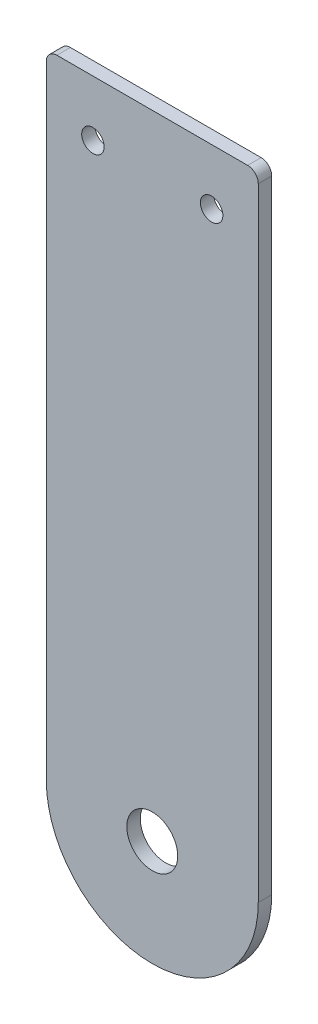
ISO-10303-21;
HEADER;
FILE_DESCRIPTION(('STEP AP214'),'2;1');
FILE_NAME('part.step','',(''),(''),'','','');
FILE_SCHEMA(('AUTOMOTIVE_DESIGN { 1 0 10303 214 1 1 1 1 }'));
ENDSEC;
DATA;
#1=APPLICATION_CONTEXT('core data for automotive mechanical design processes');
#2=APPLICATION_PROTOCOL_DEFINITION('international standard','automotive_design',2000,#1);
#3=PRODUCT_CONTEXT('',#1,'mechanical');
#4=PRODUCT('Part','Part','',(#3));
#5=PRODUCT_RELATED_PRODUCT_CATEGORY('part','',(#4));
#6=PRODUCT_DEFINITION_FORMATION('','',#4);
#7=PRODUCT_DEFINITION_CONTEXT('part definition',#1,'design');
#8=PRODUCT_DEFINITION('design','',#6,#7);
#9=PRODUCT_DEFINITION_SHAPE('','',#8);
#10=(LENGTH_UNIT() NAMED_UNIT(*) SI_UNIT(.MILLI.,.METRE.));
#11=(NAMED_UNIT(*) PLANE_ANGLE_UNIT() SI_UNIT($,.RADIAN.));
#12=(NAMED_UNIT(*) SI_UNIT($,.STERADIAN.) SOLID_ANGLE_UNIT());
#13=UNCERTAINTY_MEASURE_WITH_UNIT(LENGTH_MEASURE(1.E-05),#10,'distance_accuracy_value','');
#14=(GEOMETRIC_REPRESENTATION_CONTEXT(3) GLOBAL_UNCERTAINTY_ASSIGNED_CONTEXT((#13)) GLOBAL_UNIT_ASSIGNED_CONTEXT((#10,
#11,#12)) REPRESENTATION_CONTEXT('',''));
#15=CARTESIAN_POINT('',(0.,0.,0.));
#16=DIRECTION('',(0.,0.,1.));
#17=DIRECTION('',(1.,0.,0.));
#18=AXIS2_PLACEMENT_3D('',#15,#16,#17);
#19=CARTESIAN_POINT('',(0.,-190.,44.1));
#20=DIRECTION('',(0.,0.,1.));
#21=DIRECTION('',(1.,0.,0.));
#22=AXIS2_PLACEMENT_3D('',#19,#20,#21);
#23=CYLINDRICAL_SURFACE('',#22,25.);
#24=CARTESIAN_POINT('',(0.,-190.,47.275));
#25=DIRECTION('',(0.,0.,1.));
#26=DIRECTION('',(1.,0.,0.));
#27=AXIS2_PLACEMENT_3D('',#24,#25,#26);
#28=CIRCLE('',#27,25.);
#29=CARTESIAN_POINT('',(-25.,-190.,47.275));
#30=VERTEX_POINT('',#29);
#31=CARTESIAN_POINT('',(25.,-190.,47.275));
#32=VERTEX_POINT('',#31);
#33=EDGE_CURVE('E126',#30,#32,#28,.T.);
#34=ORIENTED_EDGE('',*,*,#33,.F.);
#35=DIRECTION('',(0.,0.,1.));
#36=VECTOR('',#35,1.);
#37=CARTESIAN_POINT('',(-25.,-190.,44.1));
#38=LINE('',#37,#36);
#39=CARTESIAN_POINT('',(-25.,-190.,44.1));
#40=VERTEX_POINT('',#39);
#41=EDGE_CURVE('E11',#40,#30,#38,.T.);
#42=ORIENTED_EDGE('',*,*,#41,.F.);
#43=CARTESIAN_POINT('',(0.,-190.,44.1));
#44=DIRECTION('',(0.,0.,1.));
#45=DIRECTION('',(1.,0.,0.));
#46=AXIS2_PLACEMENT_3D('',#43,#44,#45);
#47=CIRCLE('',#46,25.);
#48=CARTESIAN_POINT('',(25.,-190.,44.1));
#49=VERTEX_POINT('',#48);
#50=EDGE_CURVE('E141',#40,#49,#47,.T.);
#51=ORIENTED_EDGE('',*,*,#50,.T.);
#52=DIRECTION('',(0.,0.,1.));
#53=VECTOR('',#52,1.);
#54=CARTESIAN_POINT('',(25.,-190.,44.1));
#55=LINE('',#54,#53);
#56=EDGE_CURVE('E44',#49,#32,#55,.T.);
#57=ORIENTED_EDGE('',*,*,#56,.T.);
#58=EDGE_LOOP('',(#34,#42,#51,#57));
#59=FACE_BOUND('',#58,.T.);
#60=ADVANCED_FACE('F41',(#59),#23,.T.);
#61=CARTESIAN_POINT('',(-25.,-190.,44.1));
#62=DIRECTION('',(-1.,0.,0.));
#63=DIRECTION('',(0.,0.,1.));
#64=AXIS2_PLACEMENT_3D('',#61,#62,#63);
#65=PLANE('',#64);
#66=DIRECTION('',(0.,-1.,0.));
#67=VECTOR('',#66,1.);
#68=CARTESIAN_POINT('',(-25.,-190.,47.275));
#69=LINE('',#68,#67);
#70=CARTESIAN_POINT('',(-25.,-43.175,47.275));
#71=VERTEX_POINT('',#70);
#72=EDGE_CURVE('E139',#71,#30,#69,.T.);
#73=ORIENTED_EDGE('',*,*,#72,.F.);
#74=DIRECTION('',(0.,0.,1.));
#75=VECTOR('',#74,1.);
#76=CARTESIAN_POINT('',(-25.,-43.175,44.1));
#77=LINE('',#76,#75);
#78=CARTESIAN_POINT('',(-25.,-43.175,44.1));
#79=VERTEX_POINT('',#78);
#80=EDGE_CURVE('E50',#79,#71,#77,.T.);
#81=ORIENTED_EDGE('',*,*,#80,.F.);
#82=DIRECTION('',(0.,-1.,0.));
#83=VECTOR('',#82,1.);
#84=CARTESIAN_POINT('',(-25.,-190.,44.1));
#85=LINE('',#84,#83);
#86=EDGE_CURVE('E116',#79,#40,#85,.T.);
#87=ORIENTED_EDGE('',*,*,#86,.T.);
#88=ORIENTED_EDGE('',*,*,#41,.T.);
#89=EDGE_LOOP('',(#73,#81,#87,#88));
#90=FACE_BOUND('',#89,.T.);
#91=ADVANCED_FACE('F149',(#90),#65,.T.);
#92=CARTESIAN_POINT('',(-22.5,-43.175,44.1));
#93=DIRECTION('',(0.,0.,1.));
#94=DIRECTION('',(1.,0.,0.));
#95=AXIS2_PLACEMENT_3D('',#92,#93,#94);
#96=CYLINDRICAL_SURFACE('',#95,2.5);
#97=CARTESIAN_POINT('',(-22.5,-43.175,47.275));
#98=DIRECTION('',(0.,0.,1.));
#99=DIRECTION('',(-1.,0.,0.));
#100=AXIS2_PLACEMENT_3D('',#97,#98,#99);
#101=CIRCLE('',#100,2.5);
#102=CARTESIAN_POINT('',(-22.5,-40.675,47.275));
#103=VERTEX_POINT('',#102);
#104=EDGE_CURVE('E103',#103,#71,#101,.T.);
#105=ORIENTED_EDGE('',*,*,#104,.F.);
#106=DIRECTION('',(0.,0.,1.));
#107=VECTOR('',#106,1.);
#108=CARTESIAN_POINT('',(-22.5,-40.675,44.1));
#109=LINE('',#108,#107);
#110=CARTESIAN_POINT('',(-22.5,-40.675,44.1));
#111=VERTEX_POINT('',#110);
#112=EDGE_CURVE('E98',#111,#103,#109,.T.);
#113=ORIENTED_EDGE('',*,*,#112,.F.);
#114=CARTESIAN_POINT('',(-22.5,-43.175,44.1));
#115=DIRECTION('',(0.,0.,1.));
#116=DIRECTION('',(-1.,0.,0.));
#117=AXIS2_PLACEMENT_3D('',#114,#115,#116);
#118=CIRCLE('',#117,2.5);
#119=EDGE_CURVE('E101',#111,#79,#118,.T.);
#120=ORIENTED_EDGE('',*,*,#119,.T.);
#121=ORIENTED_EDGE('',*,*,#80,.T.);
#122=EDGE_LOOP('',(#105,#113,#120,#121));
#123=FACE_BOUND('',#122,.T.);
#124=ADVANCED_FACE('F100',(#123),#96,.T.);
#125=CARTESIAN_POINT('',(-22.5,-40.675,44.1));
#126=DIRECTION('',(0.,1.,0.));
#127=DIRECTION('',(-1.,0.,0.));
#128=AXIS2_PLACEMENT_3D('',#125,#126,#127);
#129=PLANE('',#128);
#130=DIRECTION('',(-1.,0.,0.));
#131=VECTOR('',#130,1.);
#132=CARTESIAN_POINT('',(-22.5,-40.675,47.275));
#133=LINE('',#132,#131);
#134=CARTESIAN_POINT('',(22.5,-40.675,47.275));
#135=VERTEX_POINT('',#134);
#136=EDGE_CURVE('E136',#135,#103,#133,.T.);
#137=ORIENTED_EDGE('',*,*,#136,.F.);
#138=DIRECTION('',(0.,0.,1.));
#139=VECTOR('',#138,1.);
#140=CARTESIAN_POINT('',(22.5,-40.675,44.1));
#141=LINE('',#140,#139);
#142=CARTESIAN_POINT('',(22.5,-40.675,44.1));
#143=VERTEX_POINT('',#142);
#144=EDGE_CURVE('E108',#143,#135,#141,.T.);
#145=ORIENTED_EDGE('',*,*,#144,.F.);
#146=DIRECTION('',(-1.,0.,0.));
#147=VECTOR('',#146,1.);
#148=CARTESIAN_POINT('',(-22.5,-40.675,44.1));
#149=LINE('',#148,#147);
#150=EDGE_CURVE('E114',#143,#111,#149,.T.);
#151=ORIENTED_EDGE('',*,*,#150,.T.);
#152=ORIENTED_EDGE('',*,*,#112,.T.);
#153=EDGE_LOOP('',(#137,#145,#151,#152));
#154=FACE_BOUND('',#153,.T.);
#155=ADVANCED_FACE('F118',(#154),#129,.T.);
#156=CARTESIAN_POINT('',(22.5,-43.175,44.1));
#157=DIRECTION('',(0.,0.,1.));
#158=DIRECTION('',(1.,0.,0.));
#159=AXIS2_PLACEMENT_3D('',#156,#157,#158);
#160=CYLINDRICAL_SURFACE('',#159,2.5);
#161=CARTESIAN_POINT('',(22.5,-43.175,47.275));
#162=DIRECTION('',(0.,0.,1.));
#163=DIRECTION('',(-1.,0.,0.));
#164=AXIS2_PLACEMENT_3D('',#161,#162,#163);
#165=CIRCLE('',#164,2.5);
#166=CARTESIAN_POINT('',(25.,-43.175,47.275));
#167=VERTEX_POINT('',#166);
#168=EDGE_CURVE('E133',#167,#135,#165,.T.);
#169=ORIENTED_EDGE('',*,*,#168,.F.);
#170=DIRECTION('',(0.,0.,1.));
#171=VECTOR('',#170,1.);
#172=CARTESIAN_POINT('',(25.,-43.175,44.1));
#173=LINE('',#172,#171);
#174=CARTESIAN_POINT('',(25.,-43.175,44.1));
#175=VERTEX_POINT('',#174);
#176=EDGE_CURVE('E144',#175,#167,#173,.T.);
#177=ORIENTED_EDGE('',*,*,#176,.F.);
#178=CARTESIAN_POINT('',(22.5,-43.175,44.1));
#179=DIRECTION('',(0.,0.,1.));
#180=DIRECTION('',(-1.,0.,0.));
#181=AXIS2_PLACEMENT_3D('',#178,#179,#180);
#182=CIRCLE('',#181,2.5);
#183=EDGE_CURVE('E119',#175,#143,#182,.T.);
#184=ORIENTED_EDGE('',*,*,#183,.T.);
#185=ORIENTED_EDGE('',*,*,#144,.T.);
#186=EDGE_LOOP('',(#169,#177,#184,#185));
#187=FACE_BOUND('',#186,.T.);
#188=ADVANCED_FACE('F162',(#187),#160,.T.);
#189=CARTESIAN_POINT('',(25.,-190.,44.1));
#190=DIRECTION('',(1.,0.,0.));
#191=DIRECTION('',(0.,0.,-1.));
#192=AXIS2_PLACEMENT_3D('',#189,#190,#191);
#193=PLANE('',#192);
#194=DIRECTION('',(0.,1.,0.));
#195=VECTOR('',#194,1.);
#196=CARTESIAN_POINT('',(25.,-190.,47.275));
#197=LINE('',#196,#195);
#198=EDGE_CURVE('E129',#32,#167,#197,.T.);
#199=ORIENTED_EDGE('',*,*,#198,.F.);
#200=ORIENTED_EDGE('',*,*,#56,.F.);
#201=DIRECTION('',(0.,1.,0.));
#202=VECTOR('',#201,1.);
#203=CARTESIAN_POINT('',(25.,-190.,44.1));
#204=LINE('',#203,#202);
#205=EDGE_CURVE('E121',#49,#175,#204,.T.);
#206=ORIENTED_EDGE('',*,*,#205,.T.);
#207=ORIENTED_EDGE('',*,*,#176,.T.);
#208=EDGE_LOOP('',(#199,#200,#206,#207));
#209=FACE_BOUND('',#208,.T.);
#210=ADVANCED_FACE('F146',(#209),#193,.T.);
#211=CARTESIAN_POINT('',(0.,-190.,44.1));
#212=DIRECTION('',(0.,0.,1.));
#213=DIRECTION('',(1.,0.,0.));
#214=AXIS2_PLACEMENT_3D('',#211,#212,#213);
#215=PLANE('',#214);
#216=CARTESIAN_POINT('',(0.,-190.,44.1));
#217=DIRECTION('',(0.,0.,1.));
#218=DIRECTION('',(1.,0.,0.));
#219=AXIS2_PLACEMENT_3D('',#216,#217,#218);
#220=CIRCLE('',#219,6.00000000000001);
#221=CARTESIAN_POINT('',(6.00000000000001,-190.,44.1));
#222=VERTEX_POINT('',#221);
#223=EDGE_CURVE('E192',#222,#222,#220,.T.);
#224=ORIENTED_EDGE('',*,*,#223,.T.);
#225=EDGE_LOOP('',(#224));
#226=FACE_BOUND('',#225,.T.);
#227=CARTESIAN_POINT('',(-14.,-53.85,44.1));
#228=DIRECTION('',(0.,0.,1.));
#229=DIRECTION('',(1.,0.,0.));
#230=AXIS2_PLACEMENT_3D('',#227,#228,#229);
#231=CIRCLE('',#230,2.65);
#232=CARTESIAN_POINT('',(-11.35,-53.85,44.1));
#233=VERTEX_POINT('',#232);
#234=EDGE_CURVE('E200',#233,#233,#231,.T.);
#235=ORIENTED_EDGE('',*,*,#234,.T.);
#236=EDGE_LOOP('',(#235));
#237=FACE_BOUND('',#236,.T.);
#238=CARTESIAN_POINT('',(14.,-53.85,44.1));
#239=DIRECTION('',(0.,0.,1.));
#240=DIRECTION('',(1.,0.,0.));
#241=AXIS2_PLACEMENT_3D('',#238,#239,#240);
#242=CIRCLE('',#241,2.65);
#243=CARTESIAN_POINT('',(16.65,-53.85,44.1));
#244=VERTEX_POINT('',#243);
#245=EDGE_CURVE('E130',#244,#244,#242,.T.);
#246=ORIENTED_EDGE('',*,*,#245,.T.);
#247=EDGE_LOOP('',(#246));
#248=FACE_BOUND('',#247,.T.);
#249=ORIENTED_EDGE('',*,*,#50,.F.);
#250=ORIENTED_EDGE('',*,*,#86,.F.);
#251=ORIENTED_EDGE('',*,*,#119,.F.);
#252=ORIENTED_EDGE('',*,*,#150,.F.);
#253=ORIENTED_EDGE('',*,*,#183,.F.);
#254=ORIENTED_EDGE('',*,*,#205,.F.);
#255=EDGE_LOOP('',(#249,#250,#251,#252,#253,#254));
#256=FACE_BOUND('',#255,.T.);
#257=ADVANCED_FACE('F112',(#226,#237,#248,#256),#215,.F.);
#258=CARTESIAN_POINT('',(0.,-190.,47.275));
#259=DIRECTION('',(0.,0.,1.));
#260=DIRECTION('',(1.,0.,0.));
#261=AXIS2_PLACEMENT_3D('',#258,#259,#260);
#262=PLANE('',#261);
#263=CARTESIAN_POINT('',(0.,-190.,47.275));
#264=DIRECTION('',(0.,0.,1.));
#265=DIRECTION('',(1.,0.,0.));
#266=AXIS2_PLACEMENT_3D('',#263,#264,#265);
#267=CIRCLE('',#266,6.00000000000001);
#268=CARTESIAN_POINT('',(6.00000000000001,-190.,47.275));
#269=VERTEX_POINT('',#268);
#270=EDGE_CURVE('E195',#269,#269,#267,.T.);
#271=ORIENTED_EDGE('',*,*,#270,.F.);
#272=EDGE_LOOP('',(#271));
#273=FACE_BOUND('',#272,.T.);
#274=CARTESIAN_POINT('',(-14.,-53.85,47.275));
#275=DIRECTION('',(0.,0.,1.));
#276=DIRECTION('',(1.,0.,0.));
#277=AXIS2_PLACEMENT_3D('',#274,#275,#276);
#278=CIRCLE('',#277,2.65);
#279=CARTESIAN_POINT('',(-11.35,-53.85,47.275));
#280=VERTEX_POINT('',#279);
#281=EDGE_CURVE('E197',#280,#280,#278,.T.);
#282=ORIENTED_EDGE('',*,*,#281,.F.);
#283=EDGE_LOOP('',(#282));
#284=FACE_BOUND('',#283,.T.);
#285=CARTESIAN_POINT('',(14.,-53.85,47.275));
#286=DIRECTION('',(0.,0.,1.));
#287=DIRECTION('',(1.,0.,0.));
#288=AXIS2_PLACEMENT_3D('',#285,#286,#287);
#289=CIRCLE('',#288,2.65);
#290=CARTESIAN_POINT('',(16.65,-53.85,47.275));
#291=VERTEX_POINT('',#290);
#292=EDGE_CURVE('E203',#291,#291,#289,.T.);
#293=ORIENTED_EDGE('',*,*,#292,.F.);
#294=EDGE_LOOP('',(#293));
#295=FACE_BOUND('',#294,.T.);
#296=ORIENTED_EDGE('',*,*,#33,.T.);
#297=ORIENTED_EDGE('',*,*,#198,.T.);
#298=ORIENTED_EDGE('',*,*,#168,.T.);
#299=ORIENTED_EDGE('',*,*,#136,.T.);
#300=ORIENTED_EDGE('',*,*,#104,.T.);
#301=ORIENTED_EDGE('',*,*,#72,.T.);
#302=EDGE_LOOP('',(#296,#297,#298,#299,#300,#301));
#303=FACE_BOUND('',#302,.T.);
#304=ADVANCED_FACE('F148',(#273,#284,#295,#303),#262,.T.);
#305=CARTESIAN_POINT('',(14.,-53.85,44.1));
#306=DIRECTION('',(0.,0.,1.));
#307=DIRECTION('',(1.,0.,0.));
#308=AXIS2_PLACEMENT_3D('',#305,#306,#307);
#309=CYLINDRICAL_SURFACE('',#308,2.65);
#310=ORIENTED_EDGE('',*,*,#245,.F.);
#311=EDGE_LOOP('',(#310));
#312=FACE_BOUND('',#311,.T.);
#313=ORIENTED_EDGE('',*,*,#292,.T.);
#314=EDGE_LOOP('',(#313));
#315=FACE_BOUND('',#314,.T.);
#316=ADVANCED_FACE('F173',(#312,#315),#309,.F.);
#317=CARTESIAN_POINT('',(-14.,-53.85,44.1));
#318=DIRECTION('',(0.,0.,1.));
#319=DIRECTION('',(1.,0.,0.));
#320=AXIS2_PLACEMENT_3D('',#317,#318,#319);
#321=CYLINDRICAL_SURFACE('',#320,2.65);
#322=ORIENTED_EDGE('',*,*,#234,.F.);
#323=EDGE_LOOP('',(#322));
#324=FACE_BOUND('',#323,.T.);
#325=ORIENTED_EDGE('',*,*,#281,.T.);
#326=EDGE_LOOP('',(#325));
#327=FACE_BOUND('',#326,.T.);
#328=ADVANCED_FACE('F180',(#324,#327),#321,.F.);
#329=CARTESIAN_POINT('',(0.,-190.,44.1));
#330=DIRECTION('',(0.,0.,1.));
#331=DIRECTION('',(1.,0.,0.));
#332=AXIS2_PLACEMENT_3D('',#329,#330,#331);
#333=CYLINDRICAL_SURFACE('',#332,6.00000000000001);
#334=ORIENTED_EDGE('',*,*,#223,.F.);
#335=EDGE_LOOP('',(#334));
#336=FACE_BOUND('',#335,.T.);
#337=ORIENTED_EDGE('',*,*,#270,.T.);
#338=EDGE_LOOP('',(#337));
#339=FACE_BOUND('',#338,.T.);
#340=ADVANCED_FACE('F184',(#336,#339),#333,.F.);
#341=CLOSED_SHELL('',(#60,#91,#124,#155,#188,#210,#257,#304,#316,#328,#340));
#342=MANIFOLD_SOLID_BREP('B2',#341);
#343=ADVANCED_BREP_SHAPE_REPRESENTATION('',(#18,#342),#14);
#344=SHAPE_DEFINITION_REPRESENTATION(#9,#343);
ENDSEC;
END-ISO-10303-21;
